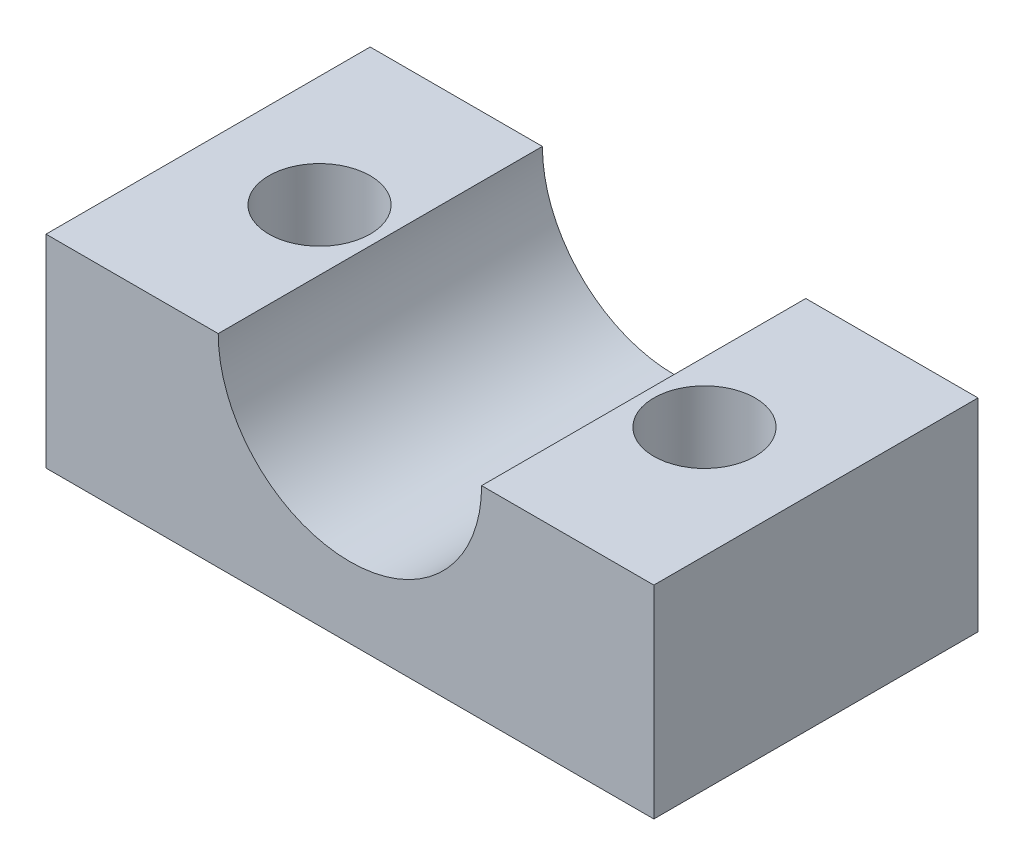
ISO-10303-21;
HEADER;
FILE_DESCRIPTION(('STEP AP214'),'2;1');
FILE_NAME('part.step','',(''),(''),'','','');
FILE_SCHEMA(('AUTOMOTIVE_DESIGN { 1 0 10303 214 1 1 1 1 }'));
ENDSEC;
DATA;
#1=APPLICATION_CONTEXT('core data for automotive mechanical design processes');
#2=APPLICATION_PROTOCOL_DEFINITION('international standard','automotive_design',2000,#1);
#3=PRODUCT_CONTEXT('',#1,'mechanical');
#4=PRODUCT('Part','Part','',(#3));
#5=PRODUCT_RELATED_PRODUCT_CATEGORY('part','',(#4));
#6=PRODUCT_DEFINITION_FORMATION('','',#4);
#7=PRODUCT_DEFINITION_CONTEXT('part definition',#1,'design');
#8=PRODUCT_DEFINITION('design','',#6,#7);
#9=PRODUCT_DEFINITION_SHAPE('','',#8);
#10=(LENGTH_UNIT() NAMED_UNIT(*) SI_UNIT(.MILLI.,.METRE.));
#11=(NAMED_UNIT(*) PLANE_ANGLE_UNIT() SI_UNIT($,.RADIAN.));
#12=(NAMED_UNIT(*) SI_UNIT($,.STERADIAN.) SOLID_ANGLE_UNIT());
#13=UNCERTAINTY_MEASURE_WITH_UNIT(LENGTH_MEASURE(1.E-05),#10,'distance_accuracy_value','');
#14=(GEOMETRIC_REPRESENTATION_CONTEXT(3) GLOBAL_UNCERTAINTY_ASSIGNED_CONTEXT((#13)) GLOBAL_UNIT_ASSIGNED_CONTEXT((#10,
#11,#12)) REPRESENTATION_CONTEXT('',''));
#15=CARTESIAN_POINT('',(0.,0.,0.));
#16=DIRECTION('',(0.,0.,1.));
#17=DIRECTION('',(1.,0.,0.));
#18=AXIS2_PLACEMENT_3D('',#15,#16,#17);
#19=CARTESIAN_POINT('',(0.,0.,32.));
#20=DIRECTION('',(0.,0.,-1.));
#21=DIRECTION('',(-1.,0.,0.));
#22=AXIS2_PLACEMENT_3D('',#19,#20,#21);
#23=CYLINDRICAL_SURFACE('',#22,13.);
#24=CARTESIAN_POINT('',(0.,0.,0.));
#25=DIRECTION('',(0.,0.,-1.));
#26=DIRECTION('',(1.,0.,0.));
#27=AXIS2_PLACEMENT_3D('',#24,#25,#26);
#28=CIRCLE('',#27,13.);
#29=CARTESIAN_POINT('',(13.,0.,0.));
#30=VERTEX_POINT('',#29);
#31=CARTESIAN_POINT('',(-13.,0.,0.));
#32=VERTEX_POINT('',#31);
#33=EDGE_CURVE('E129',#30,#32,#28,.T.);
#34=ORIENTED_EDGE('',*,*,#33,.T.);
#35=DIRECTION('',(0.,0.,-1.));
#36=VECTOR('',#35,1.);
#37=CARTESIAN_POINT('',(-13.,0.,32.));
#38=LINE('',#37,#36);
#39=CARTESIAN_POINT('',(-13.,0.,32.));
#40=VERTEX_POINT('',#39);
#41=EDGE_CURVE('E11',#40,#32,#38,.T.);
#42=ORIENTED_EDGE('',*,*,#41,.F.);
#43=CARTESIAN_POINT('',(0.,0.,32.));
#44=DIRECTION('',(0.,0.,-1.));
#45=DIRECTION('',(1.,0.,0.));
#46=AXIS2_PLACEMENT_3D('',#43,#44,#45);
#47=CIRCLE('',#46,13.);
#48=CARTESIAN_POINT('',(13.,0.,32.));
#49=VERTEX_POINT('',#48);
#50=EDGE_CURVE('E146',#49,#40,#47,.T.);
#51=ORIENTED_EDGE('',*,*,#50,.F.);
#52=DIRECTION('',(0.,0.,-1.));
#53=VECTOR('',#52,1.);
#54=CARTESIAN_POINT('',(13.,0.,32.));
#55=LINE('',#54,#53);
#56=EDGE_CURVE('E125',#49,#30,#55,.T.);
#57=ORIENTED_EDGE('',*,*,#56,.T.);
#58=EDGE_LOOP('',(#34,#42,#51,#57));
#59=FACE_BOUND('',#58,.T.);
#60=ADVANCED_FACE('F39',(#59),#23,.F.);
#61=CARTESIAN_POINT('',(-30.,0.,32.));
#62=DIRECTION('',(0.,-1.,0.));
#63=DIRECTION('',(1.,0.,0.));
#64=AXIS2_PLACEMENT_3D('',#61,#62,#63);
#65=PLANE('',#64);
#66=CARTESIAN_POINT('',(-19.,0.,16.));
#67=DIRECTION('',(0.,-1.,0.));
#68=DIRECTION('',(1.,0.,0.));
#69=AXIS2_PLACEMENT_3D('',#66,#67,#68);
#70=CIRCLE('',#69,5.);
#71=CARTESIAN_POINT('',(-14.,0.,16.));
#72=VERTEX_POINT('',#71);
#73=EDGE_CURVE('E134',#72,#72,#70,.T.);
#74=ORIENTED_EDGE('',*,*,#73,.T.);
#75=EDGE_LOOP('',(#74));
#76=FACE_BOUND('',#75,.T.);
#77=DIRECTION('',(-1.,0.,0.));
#78=VECTOR('',#77,1.);
#79=CARTESIAN_POINT('',(-30.,0.,0.));
#80=LINE('',#79,#78);
#81=CARTESIAN_POINT('',(-30.,0.,0.));
#82=VERTEX_POINT('',#81);
#83=EDGE_CURVE('E133',#32,#82,#80,.T.);
#84=ORIENTED_EDGE('',*,*,#83,.T.);
#85=DIRECTION('',(0.,0.,-1.));
#86=VECTOR('',#85,1.);
#87=CARTESIAN_POINT('',(-30.,0.,32.));
#88=LINE('',#87,#86);
#89=CARTESIAN_POINT('',(-30.,0.,32.));
#90=VERTEX_POINT('',#89);
#91=EDGE_CURVE('E49',#90,#82,#88,.T.);
#92=ORIENTED_EDGE('',*,*,#91,.F.);
#93=DIRECTION('',(-1.,0.,0.));
#94=VECTOR('',#93,1.);
#95=CARTESIAN_POINT('',(-30.,0.,32.));
#96=LINE('',#95,#94);
#97=EDGE_CURVE('E94',#40,#90,#96,.T.);
#98=ORIENTED_EDGE('',*,*,#97,.F.);
#99=ORIENTED_EDGE('',*,*,#41,.T.);
#100=EDGE_LOOP('',(#84,#92,#98,#99));
#101=FACE_BOUND('',#100,.T.);
#102=ADVANCED_FACE('F177',(#76,#101),#65,.F.);
#103=CARTESIAN_POINT('',(-30.,0.,32.));
#104=DIRECTION('',(1.,0.,0.));
#105=DIRECTION('',(0.,1.,0.));
#106=AXIS2_PLACEMENT_3D('',#103,#104,#105);
#107=PLANE('',#106);
#108=DIRECTION('',(0.,-1.,0.));
#109=VECTOR('',#108,1.);
#110=CARTESIAN_POINT('',(-30.,0.,0.));
#111=LINE('',#110,#109);
#112=CARTESIAN_POINT('',(-30.,-20.,0.));
#113=VERTEX_POINT('',#112);
#114=EDGE_CURVE('E137',#82,#113,#111,.T.);
#115=ORIENTED_EDGE('',*,*,#114,.T.);
#116=DIRECTION('',(0.,0.,-1.));
#117=VECTOR('',#116,1.);
#118=CARTESIAN_POINT('',(-30.,-20.,32.));
#119=LINE('',#118,#117);
#120=CARTESIAN_POINT('',(-30.,-20.,32.));
#121=VERTEX_POINT('',#120);
#122=EDGE_CURVE('E118',#121,#113,#119,.T.);
#123=ORIENTED_EDGE('',*,*,#122,.F.);
#124=DIRECTION('',(0.,-1.,0.));
#125=VECTOR('',#124,1.);
#126=CARTESIAN_POINT('',(-30.,0.,32.));
#127=LINE('',#126,#125);
#128=EDGE_CURVE('E107',#90,#121,#127,.T.);
#129=ORIENTED_EDGE('',*,*,#128,.F.);
#130=ORIENTED_EDGE('',*,*,#91,.T.);
#131=EDGE_LOOP('',(#115,#123,#129,#130));
#132=FACE_BOUND('',#131,.T.);
#133=ADVANCED_FACE('F157',(#132),#107,.F.);
#134=CARTESIAN_POINT('',(-30.,-20.,32.));
#135=DIRECTION('',(0.,1.,0.));
#136=DIRECTION('',(0.,0.,1.));
#137=AXIS2_PLACEMENT_3D('',#134,#135,#136);
#138=PLANE('',#137);
#139=CARTESIAN_POINT('',(-19.,-20.,16.));
#140=DIRECTION('',(0.,-1.,0.));
#141=DIRECTION('',(0.,0.,-1.));
#142=AXIS2_PLACEMENT_3D('',#139,#140,#141);
#143=CIRCLE('',#142,5.);
#144=CARTESIAN_POINT('',(-19.,-20.,11.));
#145=VERTEX_POINT('',#144);
#146=EDGE_CURVE('E195',#145,#145,#143,.T.);
#147=ORIENTED_EDGE('',*,*,#146,.F.);
#148=EDGE_LOOP('',(#147));
#149=FACE_BOUND('',#148,.T.);
#150=CARTESIAN_POINT('',(19.,-20.,16.));
#151=DIRECTION('',(0.,-1.,0.));
#152=DIRECTION('',(0.,0.,-1.));
#153=AXIS2_PLACEMENT_3D('',#150,#151,#152);
#154=CIRCLE('',#153,5.);
#155=CARTESIAN_POINT('',(19.,-20.,11.));
#156=VERTEX_POINT('',#155);
#157=EDGE_CURVE('E198',#156,#156,#154,.T.);
#158=ORIENTED_EDGE('',*,*,#157,.F.);
#159=EDGE_LOOP('',(#158));
#160=FACE_BOUND('',#159,.T.);
#161=DIRECTION('',(1.,0.,0.));
#162=VECTOR('',#161,1.);
#163=CARTESIAN_POINT('',(-30.,-20.,0.));
#164=LINE('',#163,#162);
#165=CARTESIAN_POINT('',(30.,-20.,0.));
#166=VERTEX_POINT('',#165);
#167=EDGE_CURVE('E116',#113,#166,#164,.T.);
#168=ORIENTED_EDGE('',*,*,#167,.T.);
#169=DIRECTION('',(0.,0.,-1.));
#170=VECTOR('',#169,1.);
#171=CARTESIAN_POINT('',(30.,-20.,32.));
#172=LINE('',#171,#170);
#173=CARTESIAN_POINT('',(30.,-20.,32.));
#174=VERTEX_POINT('',#173);
#175=EDGE_CURVE('E113',#174,#166,#172,.T.);
#176=ORIENTED_EDGE('',*,*,#175,.F.);
#177=DIRECTION('',(1.,0.,0.));
#178=VECTOR('',#177,1.);
#179=CARTESIAN_POINT('',(-30.,-20.,32.));
#180=LINE('',#179,#178);
#181=EDGE_CURVE('E101',#121,#174,#180,.T.);
#182=ORIENTED_EDGE('',*,*,#181,.F.);
#183=ORIENTED_EDGE('',*,*,#122,.T.);
#184=EDGE_LOOP('',(#168,#176,#182,#183));
#185=FACE_BOUND('',#184,.T.);
#186=ADVANCED_FACE('F114',(#149,#160,#185),#138,.F.);
#187=CARTESIAN_POINT('',(30.,-20.,32.));
#188=DIRECTION('',(-1.,0.,0.));
#189=DIRECTION('',(0.,0.,1.));
#190=AXIS2_PLACEMENT_3D('',#187,#188,#189);
#191=PLANE('',#190);
#192=DIRECTION('',(0.,1.,0.));
#193=VECTOR('',#192,1.);
#194=CARTESIAN_POINT('',(30.,-20.,0.));
#195=LINE('',#194,#193);
#196=CARTESIAN_POINT('',(30.,0.,0.));
#197=VERTEX_POINT('',#196);
#198=EDGE_CURVE('E80',#166,#197,#195,.T.);
#199=ORIENTED_EDGE('',*,*,#198,.T.);
#200=DIRECTION('',(0.,0.,-1.));
#201=VECTOR('',#200,1.);
#202=CARTESIAN_POINT('',(30.,0.,32.));
#203=LINE('',#202,#201);
#204=CARTESIAN_POINT('',(30.,0.,32.));
#205=VERTEX_POINT('',#204);
#206=EDGE_CURVE('E119',#205,#197,#203,.T.);
#207=ORIENTED_EDGE('',*,*,#206,.F.);
#208=DIRECTION('',(0.,1.,0.));
#209=VECTOR('',#208,1.);
#210=CARTESIAN_POINT('',(30.,-20.,32.));
#211=LINE('',#210,#209);
#212=EDGE_CURVE('E105',#174,#205,#211,.T.);
#213=ORIENTED_EDGE('',*,*,#212,.F.);
#214=ORIENTED_EDGE('',*,*,#175,.T.);
#215=EDGE_LOOP('',(#199,#207,#213,#214));
#216=FACE_BOUND('',#215,.T.);
#217=ADVANCED_FACE('F121',(#216),#191,.F.);
#218=CARTESIAN_POINT('',(13.,0.,32.));
#219=DIRECTION('',(0.,-1.,0.));
#220=DIRECTION('',(1.,0.,0.));
#221=AXIS2_PLACEMENT_3D('',#218,#219,#220);
#222=PLANE('',#221);
#223=CARTESIAN_POINT('',(19.,0.,16.));
#224=DIRECTION('',(0.,-1.,0.));
#225=DIRECTION('',(1.,0.,0.));
#226=AXIS2_PLACEMENT_3D('',#223,#224,#225);
#227=CIRCLE('',#226,5.);
#228=CARTESIAN_POINT('',(24.,0.,16.));
#229=VERTEX_POINT('',#228);
#230=EDGE_CURVE('E42',#229,#229,#227,.T.);
#231=ORIENTED_EDGE('',*,*,#230,.T.);
#232=EDGE_LOOP('',(#231));
#233=FACE_BOUND('',#232,.T.);
#234=DIRECTION('',(-1.,0.,0.));
#235=VECTOR('',#234,1.);
#236=CARTESIAN_POINT('',(13.,0.,0.));
#237=LINE('',#236,#235);
#238=EDGE_CURVE('E86',#197,#30,#237,.T.);
#239=ORIENTED_EDGE('',*,*,#238,.T.);
#240=ORIENTED_EDGE('',*,*,#56,.F.);
#241=DIRECTION('',(-1.,0.,0.));
#242=VECTOR('',#241,1.);
#243=CARTESIAN_POINT('',(13.,0.,32.));
#244=LINE('',#243,#242);
#245=EDGE_CURVE('E57',#205,#49,#244,.T.);
#246=ORIENTED_EDGE('',*,*,#245,.F.);
#247=ORIENTED_EDGE('',*,*,#206,.T.);
#248=EDGE_LOOP('',(#239,#240,#246,#247));
#249=FACE_BOUND('',#248,.T.);
#250=ADVANCED_FACE('F164',(#233,#249),#222,.F.);
#251=CARTESIAN_POINT('',(0.,0.,32.));
#252=DIRECTION('',(0.,0.,1.));
#253=DIRECTION('',(1.,0.,0.));
#254=AXIS2_PLACEMENT_3D('',#251,#252,#253);
#255=PLANE('',#254);
#256=ORIENTED_EDGE('',*,*,#50,.T.);
#257=ORIENTED_EDGE('',*,*,#97,.T.);
#258=ORIENTED_EDGE('',*,*,#128,.T.);
#259=ORIENTED_EDGE('',*,*,#181,.T.);
#260=ORIENTED_EDGE('',*,*,#212,.T.);
#261=ORIENTED_EDGE('',*,*,#245,.T.);
#262=EDGE_LOOP('',(#256,#257,#258,#259,#260,#261));
#263=FACE_BOUND('',#262,.T.);
#264=ADVANCED_FACE('F103',(#263),#255,.T.);
#265=CARTESIAN_POINT('',(0.,0.,0.));
#266=DIRECTION('',(0.,0.,1.));
#267=DIRECTION('',(1.,0.,0.));
#268=AXIS2_PLACEMENT_3D('',#265,#266,#267);
#269=PLANE('',#268);
#270=ORIENTED_EDGE('',*,*,#33,.F.);
#271=ORIENTED_EDGE('',*,*,#238,.F.);
#272=ORIENTED_EDGE('',*,*,#198,.F.);
#273=ORIENTED_EDGE('',*,*,#167,.F.);
#274=ORIENTED_EDGE('',*,*,#114,.F.);
#275=ORIENTED_EDGE('',*,*,#83,.F.);
#276=EDGE_LOOP('',(#270,#271,#272,#273,#274,#275));
#277=FACE_BOUND('',#276,.T.);
#278=ADVANCED_FACE('F160',(#277),#269,.F.);
#279=CARTESIAN_POINT('',(19.,12.,16.));
#280=DIRECTION('',(0.,-1.,0.));
#281=DIRECTION('',(0.,0.,-1.));
#282=AXIS2_PLACEMENT_3D('',#279,#280,#281);
#283=CYLINDRICAL_SURFACE('',#282,5.);
#284=ORIENTED_EDGE('',*,*,#157,.T.);
#285=EDGE_LOOP('',(#284));
#286=FACE_BOUND('',#285,.T.);
#287=ORIENTED_EDGE('',*,*,#230,.F.);
#288=EDGE_LOOP('',(#287));
#289=FACE_BOUND('',#288,.T.);
#290=ADVANCED_FACE('F214',(#286,#289),#283,.F.);
#291=CARTESIAN_POINT('',(-19.,12.,16.));
#292=DIRECTION('',(0.,-1.,0.));
#293=DIRECTION('',(0.,0.,-1.));
#294=AXIS2_PLACEMENT_3D('',#291,#292,#293);
#295=CYLINDRICAL_SURFACE('',#294,5.);
#296=ORIENTED_EDGE('',*,*,#146,.T.);
#297=EDGE_LOOP('',(#296));
#298=FACE_BOUND('',#297,.T.);
#299=ORIENTED_EDGE('',*,*,#73,.F.);
#300=EDGE_LOOP('',(#299));
#301=FACE_BOUND('',#300,.T.);
#302=ADVANCED_FACE('F216',(#298,#301),#295,.F.);
#303=CLOSED_SHELL('',(#60,#102,#133,#186,#217,#250,#264,#278,#290,#302));
#304=MANIFOLD_SOLID_BREP('B2',#303);
#305=ADVANCED_BREP_SHAPE_REPRESENTATION('',(#18,#304),#14);
#306=SHAPE_DEFINITION_REPRESENTATION(#9,#305);
ENDSEC;
END-ISO-10303-21;
